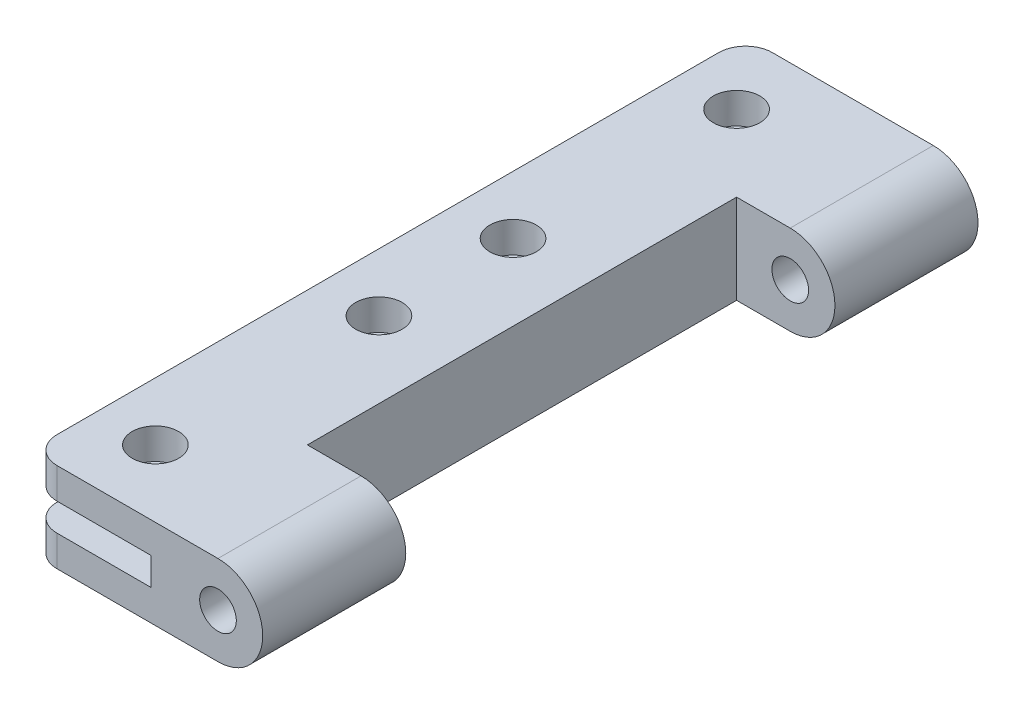
ISO-10303-21;
HEADER;
FILE_DESCRIPTION(('STEP AP214'),'2;1');
FILE_NAME('part.step','',(''),(''),'','','');
FILE_SCHEMA(('AUTOMOTIVE_DESIGN { 1 0 10303 214 1 1 1 1 }'));
ENDSEC;
DATA;
#1=APPLICATION_CONTEXT('core data for automotive mechanical design processes');
#2=APPLICATION_PROTOCOL_DEFINITION('international standard','automotive_design',2000,#1);
#3=PRODUCT_CONTEXT('',#1,'mechanical');
#4=PRODUCT('Part','Part','',(#3));
#5=PRODUCT_RELATED_PRODUCT_CATEGORY('part','',(#4));
#6=PRODUCT_DEFINITION_FORMATION('','',#4);
#7=PRODUCT_DEFINITION_CONTEXT('part definition',#1,'design');
#8=PRODUCT_DEFINITION('design','',#6,#7);
#9=PRODUCT_DEFINITION_SHAPE('','',#8);
#10=(LENGTH_UNIT() NAMED_UNIT(*) SI_UNIT(.MILLI.,.METRE.));
#11=(NAMED_UNIT(*) PLANE_ANGLE_UNIT() SI_UNIT($,.RADIAN.));
#12=(NAMED_UNIT(*) SI_UNIT($,.STERADIAN.) SOLID_ANGLE_UNIT());
#13=UNCERTAINTY_MEASURE_WITH_UNIT(LENGTH_MEASURE(1.E-05),#10,'distance_accuracy_value','');
#14=(GEOMETRIC_REPRESENTATION_CONTEXT(3) GLOBAL_UNCERTAINTY_ASSIGNED_CONTEXT((#13)) GLOBAL_UNIT_ASSIGNED_CONTEXT((#10,
#11,#12)) REPRESENTATION_CONTEXT('',''));
#15=CARTESIAN_POINT('',(0.,0.,0.));
#16=DIRECTION('',(0.,0.,1.));
#17=DIRECTION('',(1.,0.,0.));
#18=AXIS2_PLACEMENT_3D('',#15,#16,#17);
#19=CARTESIAN_POINT('',(21.,0.,80.));
#20=DIRECTION('',(0.,0.,-1.));
#21=DIRECTION('',(-1.,0.,0.));
#22=AXIS2_PLACEMENT_3D('',#19,#20,#21);
#23=CYLINDRICAL_SURFACE('',#22,5.);
#24=DIRECTION('',(0.,0.,-1.));
#25=VECTOR('',#24,1.);
#26=CARTESIAN_POINT('',(21.,5.,80.));
#27=LINE('',#26,#25);
#28=CARTESIAN_POINT('',(21.,5.,16.));
#29=VERTEX_POINT('',#28);
#30=CARTESIAN_POINT('',(21.,5.,0.));
#31=VERTEX_POINT('',#30);
#32=EDGE_CURVE('E269',#29,#31,#27,.T.);
#33=ORIENTED_EDGE('',*,*,#32,.F.);
#34=CARTESIAN_POINT('',(21.,0.,16.));
#35=DIRECTION('',(0.,0.,-1.));
#36=DIRECTION('',(-1.,0.,0.));
#37=AXIS2_PLACEMENT_3D('',#34,#35,#36);
#38=CIRCLE('',#37,5.);
#39=CARTESIAN_POINT('',(21.,-5.,16.));
#40=VERTEX_POINT('',#39);
#41=EDGE_CURVE('E181',#29,#40,#38,.T.);
#42=ORIENTED_EDGE('',*,*,#41,.T.);
#43=DIRECTION('',(0.,0.,-1.));
#44=VECTOR('',#43,1.);
#45=CARTESIAN_POINT('',(21.,-5.,80.));
#46=LINE('',#45,#44);
#47=CARTESIAN_POINT('',(21.,-5.,0.));
#48=VERTEX_POINT('',#47);
#49=EDGE_CURVE('E271',#40,#48,#46,.T.);
#50=ORIENTED_EDGE('',*,*,#49,.T.);
#51=CARTESIAN_POINT('',(21.,0.,0.));
#52=DIRECTION('',(0.,0.,1.));
#53=DIRECTION('',(-1.,0.,0.));
#54=AXIS2_PLACEMENT_3D('',#51,#52,#53);
#55=CIRCLE('',#54,5.);
#56=EDGE_CURVE('E264',#48,#31,#55,.T.);
#57=ORIENTED_EDGE('',*,*,#56,.T.);
#58=EDGE_LOOP('',(#33,#42,#50,#57));
#59=FACE_BOUND('',#58,.T.);
#60=ADVANCED_FACE('F34',(#59),#23,.T.);
#61=CARTESIAN_POINT('',(21.,0.,80.));
#62=DIRECTION('',(0.,0.,-1.));
#63=DIRECTION('',(-1.,0.,0.));
#64=AXIS2_PLACEMENT_3D('',#61,#62,#63);
#65=CYLINDRICAL_SURFACE('',#64,2.05);
#66=CARTESIAN_POINT('',(21.,0.,16.));
#67=DIRECTION('',(0.,0.,-1.));
#68=DIRECTION('',(-1.,0.,0.));
#69=AXIS2_PLACEMENT_3D('',#66,#67,#68);
#70=CIRCLE('',#69,2.05);
#71=CARTESIAN_POINT('',(18.95,0.,16.));
#72=VERTEX_POINT('',#71);
#73=EDGE_CURVE('E180',#72,#72,#70,.T.);
#74=CARTESIAN_POINT('',(21.,0.,0.));
#75=DIRECTION('',(0.,0.,1.));
#76=DIRECTION('',(1.,0.,0.));
#77=AXIS2_PLACEMENT_3D('',#74,#75,#76);
#78=CIRCLE('',#77,2.05);
#79=CARTESIAN_POINT('',(18.95,0.,0.));
#80=VERTEX_POINT('',#79);
#81=EDGE_CURVE('E247',#80,#80,#78,.T.);
#82=CARTESIAN_POINT('',(18.95,0.,16.));
#83=CARTESIAN_POINT('',(18.95,0.,15.8333333333333));
#84=CARTESIAN_POINT('',(18.95,0.,15.6666666666667));
#85=CARTESIAN_POINT('',(18.95,0.,15.3333333333333));
#86=CARTESIAN_POINT('',(18.95,0.,15.1666666666667));
#87=CARTESIAN_POINT('',(18.95,0.,14.8333333333333));
#88=CARTESIAN_POINT('',(18.95,0.,14.6666666666667));
#89=CARTESIAN_POINT('',(18.95,0.,14.3333333333333));
#90=CARTESIAN_POINT('',(18.95,0.,14.1666666666667));
#91=CARTESIAN_POINT('',(18.95,0.,13.8333333333333));
#92=CARTESIAN_POINT('',(18.95,0.,13.6666666666667));
#93=CARTESIAN_POINT('',(18.95,0.,13.3333333333333));
#94=CARTESIAN_POINT('',(18.95,0.,13.1666666666667));
#95=CARTESIAN_POINT('',(18.95,0.,12.8333333333333));
#96=CARTESIAN_POINT('',(18.95,0.,12.6666666666667));
#97=CARTESIAN_POINT('',(18.95,0.,12.3333333333333));
#98=CARTESIAN_POINT('',(18.95,0.,12.1666666666667));
#99=CARTESIAN_POINT('',(18.95,0.,11.8333333333333));
#100=CARTESIAN_POINT('',(18.95,0.,11.6666666666667));
#101=CARTESIAN_POINT('',(18.95,0.,11.3333333333333));
#102=CARTESIAN_POINT('',(18.95,0.,11.1666666666667));
#103=CARTESIAN_POINT('',(18.95,0.,10.8333333333333));
#104=CARTESIAN_POINT('',(18.95,0.,10.6666666666667));
#105=CARTESIAN_POINT('',(18.95,0.,10.3333333333333));
#106=CARTESIAN_POINT('',(18.95,0.,10.1666666666667));
#107=CARTESIAN_POINT('',(18.95,0.,9.83333333333334));
#108=CARTESIAN_POINT('',(18.95,0.,9.66666666666667));
#109=CARTESIAN_POINT('',(18.95,0.,9.33333333333334));
#110=CARTESIAN_POINT('',(18.95,0.,9.16666666666667));
#111=CARTESIAN_POINT('',(18.95,0.,8.83333333333334));
#112=CARTESIAN_POINT('',(18.95,0.,8.66666666666667));
#113=CARTESIAN_POINT('',(18.95,0.,8.33333333333334));
#114=CARTESIAN_POINT('',(18.95,0.,8.16666666666667));
#115=CARTESIAN_POINT('',(18.95,0.,7.83333333333334));
#116=CARTESIAN_POINT('',(18.95,0.,7.66666666666667));
#117=CARTESIAN_POINT('',(18.95,0.,7.33333333333334));
#118=CARTESIAN_POINT('',(18.95,0.,7.16666666666667));
#119=CARTESIAN_POINT('',(18.95,0.,6.83333333333334));
#120=CARTESIAN_POINT('',(18.95,0.,6.66666666666667));
#121=CARTESIAN_POINT('',(18.95,0.,6.33333333333334));
#122=CARTESIAN_POINT('',(18.95,0.,6.16666666666667));
#123=CARTESIAN_POINT('',(18.95,0.,5.83333333333334));
#124=CARTESIAN_POINT('',(18.95,0.,5.66666666666667));
#125=CARTESIAN_POINT('',(18.95,0.,5.33333333333334));
#126=CARTESIAN_POINT('',(18.95,0.,5.16666666666667));
#127=CARTESIAN_POINT('',(18.95,0.,4.83333333333334));
#128=CARTESIAN_POINT('',(18.95,0.,4.66666666666667));
#129=CARTESIAN_POINT('',(18.95,0.,4.33333333333334));
#130=CARTESIAN_POINT('',(18.95,0.,4.16666666666667));
#131=CARTESIAN_POINT('',(18.95,0.,3.83333333333334));
#132=CARTESIAN_POINT('',(18.95,0.,3.66666666666667));
#133=CARTESIAN_POINT('',(18.95,0.,3.33333333333334));
#134=CARTESIAN_POINT('',(18.95,0.,3.16666666666667));
#135=CARTESIAN_POINT('',(18.95,0.,2.83333333333334));
#136=CARTESIAN_POINT('',(18.95,0.,2.66666666666667));
#137=CARTESIAN_POINT('',(18.95,0.,2.33333333333334));
#138=CARTESIAN_POINT('',(18.95,0.,2.16666666666667));
#139=CARTESIAN_POINT('',(18.95,0.,1.83333333333334));
#140=CARTESIAN_POINT('',(18.95,0.,1.66666666666667));
#141=CARTESIAN_POINT('',(18.95,0.,1.33333333333333));
#142=CARTESIAN_POINT('',(18.95,0.,1.16666666666667));
#143=CARTESIAN_POINT('',(18.95,0.,0.833333333333334));
#144=CARTESIAN_POINT('',(18.95,0.,0.666666666666667));
#145=CARTESIAN_POINT('',(18.95,0.,0.333333333333334));
#146=CARTESIAN_POINT('',(18.95,0.,0.166666666666667));
#147=CARTESIAN_POINT('',(18.95,0.,0.));
#148=B_SPLINE_CURVE_WITH_KNOTS('',3,(#82,#83,#84,#85,#86,#87,#88,#89,#90,#91,#92,#93,#94,#95,
#96,#97,#98,#99,#100,#101,#102,#103,#104,#105,#106,#107,#108,#109,#110,#111,#112,#113,#114,#115,
#116,#117,#118,#119,#120,#121,#122,#123,#124,#125,#126,#127,#128,#129,#130,#131,#132,#133,#134,
#135,#136,#137,#138,#139,#140,#141,#142,#143,#144,#145,#146,#147),.UNSPECIFIED.,.F.,.F.,(4,2,2,
2,2,2,2,2,2,2,2,2,2,2,2,2,2,2,2,2,2,2,2,2,2,2,2,2,2,2,2,2,4),(0.,0.5,1.,1.5,2.,2.5,3.,3.5,4.,
4.5,5.,5.50000000000001,6.00000000000001,6.50000000000001,7.00000000000001,7.50000000000001,
8.00000000000001,8.50000000000001,9.00000000000001,9.50000000000001,10.,10.5,11.,11.5,12.,12.5,
13.,13.5,14.,14.5,15.,15.5,16.),.UNSPECIFIED.);
#149=EDGE_CURVE('BSEAM397',#72,#80,#148,.T.);
#150=ORIENTED_EDGE('',*,*,#73,.F.);
#151=ORIENTED_EDGE('',*,*,#81,.F.);
#152=ORIENTED_EDGE('',*,*,#149,.T.);
#153=ORIENTED_EDGE('',*,*,#149,.F.);
#154=EDGE_LOOP('',(#150,#152,#151,#153));
#155=FACE_BOUND('',#154,.T.);
#156=ADVANCED_FACE('F397',(#155),#65,.F.);
#157=CARTESIAN_POINT('',(0.,-5.,80.));
#158=DIRECTION('',(1.,0.,0.));
#159=DIRECTION('',(0.,1.,0.));
#160=AXIS2_PLACEMENT_3D('',#157,#158,#159);
#161=PLANE('',#160);
#162=DIRECTION('',(0.,0.,1.));
#163=VECTOR('',#162,1.);
#164=CARTESIAN_POINT('',(0.,1.55,80.));
#165=LINE('',#164,#163);
#166=CARTESIAN_POINT('',(0.,1.55,3.));
#167=VERTEX_POINT('',#166);
#168=CARTESIAN_POINT('',(0.,1.55,77.));
#169=VERTEX_POINT('',#168);
#170=EDGE_CURVE('E281',#167,#169,#165,.T.);
#171=ORIENTED_EDGE('',*,*,#170,.T.);
#172=DIRECTION('',(0.,-1.,0.));
#173=VECTOR('',#172,1.);
#174=CARTESIAN_POINT('',(0.,-5.,77.));
#175=LINE('',#174,#173);
#176=CARTESIAN_POINT('',(0.,5.,77.));
#177=VERTEX_POINT('',#176);
#178=EDGE_CURVE('E324',#169,#177,#175,.F.);
#179=ORIENTED_EDGE('',*,*,#178,.T.);
#180=DIRECTION('',(0.,0.,-1.));
#181=VECTOR('',#180,1.);
#182=CARTESIAN_POINT('',(0.,5.,80.));
#183=LINE('',#182,#181);
#184=CARTESIAN_POINT('',(0.,5.,3.00000000000003));
#185=VERTEX_POINT('',#184);
#186=EDGE_CURVE('E262',#177,#185,#183,.T.);
#187=ORIENTED_EDGE('',*,*,#186,.T.);
#188=DIRECTION('',(0.,-1.,0.));
#189=VECTOR('',#188,1.);
#190=CARTESIAN_POINT('',(0.,1.55,3.));
#191=LINE('',#190,#189);
#192=EDGE_CURVE('E321',#185,#167,#191,.T.);
#193=ORIENTED_EDGE('',*,*,#192,.T.);
#194=EDGE_LOOP('',(#171,#179,#187,#193));
#195=FACE_BOUND('',#194,.T.);
#196=ADVANCED_FACE('F343',(#195),#161,.F.);
#197=CARTESIAN_POINT('',(21.,0.,80.));
#198=DIRECTION('',(0.,0.,-1.));
#199=DIRECTION('',(-1.,0.,0.));
#200=AXIS2_PLACEMENT_3D('',#197,#198,#199);
#201=PLANE('',#200);
#202=DIRECTION('',(1.,0.,0.));
#203=VECTOR('',#202,1.);
#204=CARTESIAN_POINT('',(13.5,-1.55,80.));
#205=LINE('',#204,#203);
#206=CARTESIAN_POINT('',(3.,-1.55,80.));
#207=VERTEX_POINT('',#206);
#208=CARTESIAN_POINT('',(13.5,-1.55,80.));
#209=VERTEX_POINT('',#208);
#210=EDGE_CURVE('E229',#207,#209,#205,.T.);
#211=ORIENTED_EDGE('',*,*,#210,.F.);
#212=DIRECTION('',(0.,-1.,0.));
#213=VECTOR('',#212,1.);
#214=CARTESIAN_POINT('',(3.,0.,80.));
#215=LINE('',#214,#213);
#216=CARTESIAN_POINT('',(3.00000000000001,-5.,80.));
#217=VERTEX_POINT('',#216);
#218=EDGE_CURVE('E301',#207,#217,#215,.T.);
#219=ORIENTED_EDGE('',*,*,#218,.T.);
#220=DIRECTION('',(1.,0.,0.));
#221=VECTOR('',#220,1.);
#222=CARTESIAN_POINT('',(21.,-5.,80.));
#223=LINE('',#222,#221);
#224=CARTESIAN_POINT('',(21.,-5.,80.));
#225=VERTEX_POINT('',#224);
#226=EDGE_CURVE('E254',#217,#225,#223,.T.);
#227=ORIENTED_EDGE('',*,*,#226,.T.);
#228=CARTESIAN_POINT('',(21.,0.,80.));
#229=DIRECTION('',(0.,0.,1.));
#230=DIRECTION('',(-1.,0.,0.));
#231=AXIS2_PLACEMENT_3D('',#228,#229,#230);
#232=CIRCLE('',#231,5.);
#233=CARTESIAN_POINT('',(21.,5.,80.));
#234=VERTEX_POINT('',#233);
#235=EDGE_CURVE('E256',#225,#234,#232,.T.);
#236=ORIENTED_EDGE('',*,*,#235,.T.);
#237=DIRECTION('',(-1.,0.,0.));
#238=VECTOR('',#237,1.);
#239=CARTESIAN_POINT('',(0.,5.,80.));
#240=LINE('',#239,#238);
#241=CARTESIAN_POINT('',(3.,5.,80.));
#242=VERTEX_POINT('',#241);
#243=EDGE_CURVE('E259',#234,#242,#240,.T.);
#244=ORIENTED_EDGE('',*,*,#243,.T.);
#245=DIRECTION('',(0.,-1.,0.));
#246=VECTOR('',#245,1.);
#247=CARTESIAN_POINT('',(3.,0.,80.));
#248=LINE('',#247,#246);
#249=CARTESIAN_POINT('',(3.,1.55,80.));
#250=VERTEX_POINT('',#249);
#251=EDGE_CURVE('E286',#242,#250,#248,.T.);
#252=ORIENTED_EDGE('',*,*,#251,.T.);
#253=DIRECTION('',(-1.,0.,0.));
#254=VECTOR('',#253,1.);
#255=CARTESIAN_POINT('',(0.,1.55,80.));
#256=LINE('',#255,#254);
#257=CARTESIAN_POINT('',(13.5,1.55,80.));
#258=VERTEX_POINT('',#257);
#259=EDGE_CURVE('E234',#258,#250,#256,.T.);
#260=ORIENTED_EDGE('',*,*,#259,.F.);
#261=DIRECTION('',(0.,1.,0.));
#262=VECTOR('',#261,1.);
#263=CARTESIAN_POINT('',(13.5,1.55,80.));
#264=LINE('',#263,#262);
#265=EDGE_CURVE('E231',#209,#258,#264,.T.);
#266=ORIENTED_EDGE('',*,*,#265,.F.);
#267=EDGE_LOOP('',(#211,#219,#227,#236,#244,#252,#260,#266));
#268=FACE_BOUND('',#267,.T.);
#269=CARTESIAN_POINT('',(21.,0.,80.));
#270=DIRECTION('',(0.,0.,1.));
#271=DIRECTION('',(1.,0.,0.));
#272=AXIS2_PLACEMENT_3D('',#269,#270,#271);
#273=CIRCLE('',#272,2.05);
#274=CARTESIAN_POINT('',(18.95,0.,80.));
#275=VERTEX_POINT('',#274);
#276=EDGE_CURVE('E248',#275,#275,#273,.T.);
#277=ORIENTED_EDGE('',*,*,#276,.F.);
#278=EDGE_LOOP('',(#277));
#279=FACE_BOUND('',#278,.T.);
#280=ADVANCED_FACE('F334',(#268,#279),#201,.F.);
#281=CARTESIAN_POINT('',(21.,0.,0.));
#282=DIRECTION('',(0.,0.,-1.));
#283=DIRECTION('',(-1.,0.,0.));
#284=AXIS2_PLACEMENT_3D('',#281,#282,#283);
#285=PLANE('',#284);
#286=DIRECTION('',(1.,0.,0.));
#287=VECTOR('',#286,1.);
#288=CARTESIAN_POINT('',(21.,-5.,0.));
#289=LINE('',#288,#287);
#290=CARTESIAN_POINT('',(3.00000000000001,-5.,0.));
#291=VERTEX_POINT('',#290);
#292=EDGE_CURVE('E251',#291,#48,#289,.T.);
#293=ORIENTED_EDGE('',*,*,#292,.F.);
#294=DIRECTION('',(0.,-1.,0.));
#295=VECTOR('',#294,1.);
#296=CARTESIAN_POINT('',(3.,-1.55,0.));
#297=LINE('',#296,#295);
#298=CARTESIAN_POINT('',(3.,-1.55,0.));
#299=VERTEX_POINT('',#298);
#300=EDGE_CURVE('E11',#291,#299,#297,.F.);
#301=ORIENTED_EDGE('',*,*,#300,.T.);
#302=DIRECTION('',(-1.,0.,0.));
#303=VECTOR('',#302,1.);
#304=CARTESIAN_POINT('',(21.,-1.55,0.));
#305=LINE('',#304,#303);
#306=CARTESIAN_POINT('',(13.5,-1.55,0.));
#307=VERTEX_POINT('',#306);
#308=EDGE_CURVE('E240',#307,#299,#305,.T.);
#309=ORIENTED_EDGE('',*,*,#308,.F.);
#310=DIRECTION('',(0.,-1.,0.));
#311=VECTOR('',#310,1.);
#312=CARTESIAN_POINT('',(13.5,0.,0.));
#313=LINE('',#312,#311);
#314=CARTESIAN_POINT('',(13.5,1.55,0.));
#315=VERTEX_POINT('',#314);
#316=EDGE_CURVE('E284',#315,#307,#313,.T.);
#317=ORIENTED_EDGE('',*,*,#316,.F.);
#318=DIRECTION('',(1.,0.,0.));
#319=VECTOR('',#318,1.);
#320=CARTESIAN_POINT('',(21.,1.55,0.));
#321=LINE('',#320,#319);
#322=CARTESIAN_POINT('',(3.,1.55,0.));
#323=VERTEX_POINT('',#322);
#324=EDGE_CURVE('E245',#323,#315,#321,.T.);
#325=ORIENTED_EDGE('',*,*,#324,.F.);
#326=DIRECTION('',(0.,-1.,0.));
#327=VECTOR('',#326,1.);
#328=CARTESIAN_POINT('',(3.,5.,0.));
#329=LINE('',#328,#327);
#330=CARTESIAN_POINT('',(3.,5.,0.));
#331=VERTEX_POINT('',#330);
#332=EDGE_CURVE('E42',#323,#331,#329,.F.);
#333=ORIENTED_EDGE('',*,*,#332,.T.);
#334=DIRECTION('',(-1.,0.,0.));
#335=VECTOR('',#334,1.);
#336=CARTESIAN_POINT('',(0.,5.,0.));
#337=LINE('',#336,#335);
#338=EDGE_CURVE('E257',#31,#331,#337,.T.);
#339=ORIENTED_EDGE('',*,*,#338,.F.);
#340=ORIENTED_EDGE('',*,*,#56,.F.);
#341=EDGE_LOOP('',(#293,#301,#309,#317,#325,#333,#339,#340));
#342=FACE_BOUND('',#341,.T.);
#343=ORIENTED_EDGE('',*,*,#81,.T.);
#344=EDGE_LOOP('',(#343));
#345=FACE_BOUND('',#344,.T.);
#346=ADVANCED_FACE('F349',(#342,#345),#285,.T.);
#347=DIRECTION('',(0.,0.,-1.));
#348=VECTOR('',#347,1.);
#349=CARTESIAN_POINT('',(0.,-5.,80.));
#350=LINE('',#349,#348);
#351=CARTESIAN_POINT('',(0.,-5.,77.));
#352=VERTEX_POINT('',#351);
#353=CARTESIAN_POINT('',(0.,-5.,3.00000000000003));
#354=VERTEX_POINT('',#353);
#355=EDGE_CURVE('E275',#352,#354,#350,.T.);
#356=ORIENTED_EDGE('',*,*,#355,.F.);
#357=DIRECTION('',(0.,-1.,0.));
#358=VECTOR('',#357,1.);
#359=CARTESIAN_POINT('',(0.,-5.,77.));
#360=LINE('',#359,#358);
#361=CARTESIAN_POINT('',(0.,-1.55,77.));
#362=VERTEX_POINT('',#361);
#363=EDGE_CURVE('E311',#352,#362,#360,.F.);
#364=ORIENTED_EDGE('',*,*,#363,.T.);
#365=DIRECTION('',(0.,0.,-1.));
#366=VECTOR('',#365,1.);
#367=CARTESIAN_POINT('',(0.,-1.55,80.));
#368=LINE('',#367,#366);
#369=CARTESIAN_POINT('',(0.,-1.55,3.));
#370=VERTEX_POINT('',#369);
#371=EDGE_CURVE('E278',#362,#370,#368,.T.);
#372=ORIENTED_EDGE('',*,*,#371,.T.);
#373=DIRECTION('',(0.,-1.,0.));
#374=VECTOR('',#373,1.);
#375=CARTESIAN_POINT('',(0.,-5.,3.));
#376=LINE('',#375,#374);
#377=EDGE_CURVE('E308',#370,#354,#376,.T.);
#378=ORIENTED_EDGE('',*,*,#377,.T.);
#379=EDGE_LOOP('',(#356,#364,#372,#378));
#380=FACE_BOUND('',#379,.T.);
#381=ADVANCED_FACE('F372',(#380),#161,.F.);
#382=CARTESIAN_POINT('',(21.,-5.,80.));
#383=DIRECTION('',(0.,1.,0.));
#384=DIRECTION('',(-1.,0.,0.));
#385=AXIS2_PLACEMENT_3D('',#382,#383,#384);
#386=PLANE('',#385);
#387=ORIENTED_EDGE('',*,*,#226,.F.);
#388=CARTESIAN_POINT('',(3.,-5.,77.));
#389=DIRECTION('',(0.,1.,0.));
#390=DIRECTION('',(-1.,0.,0.));
#391=AXIS2_PLACEMENT_3D('',#388,#389,#390);
#392=CIRCLE('',#391,3.);
#393=EDGE_CURVE('E306',#217,#352,#392,.F.);
#394=ORIENTED_EDGE('',*,*,#393,.T.);
#395=ORIENTED_EDGE('',*,*,#355,.T.);
#396=CARTESIAN_POINT('',(3.,-5.,3.));
#397=DIRECTION('',(0.,1.,0.));
#398=DIRECTION('',(-1.,0.,0.));
#399=AXIS2_PLACEMENT_3D('',#396,#397,#398);
#400=CIRCLE('',#399,3.);
#401=EDGE_CURVE('E304',#354,#291,#400,.F.);
#402=ORIENTED_EDGE('',*,*,#401,.T.);
#403=ORIENTED_EDGE('',*,*,#292,.T.);
#404=ORIENTED_EDGE('',*,*,#49,.F.);
#405=DIRECTION('',(-1.,0.,0.));
#406=VECTOR('',#405,1.);
#407=CARTESIAN_POINT('',(21.,-5.,16.));
#408=LINE('',#407,#406);
#409=CARTESIAN_POINT('',(14.9999999999998,-5.,16.));
#410=VERTEX_POINT('',#409);
#411=EDGE_CURVE('E184',#40,#410,#408,.T.);
#412=ORIENTED_EDGE('',*,*,#411,.T.);
#413=DIRECTION('',(0.,0.,1.));
#414=VECTOR('',#413,1.);
#415=CARTESIAN_POINT('',(14.9999999999998,-5.,80.));
#416=LINE('',#415,#414);
#417=CARTESIAN_POINT('',(14.9999999999998,-5.,64.));
#418=VERTEX_POINT('',#417);
#419=EDGE_CURVE('E187',#410,#418,#416,.T.);
#420=ORIENTED_EDGE('',*,*,#419,.T.);
#421=DIRECTION('',(1.,0.,0.));
#422=VECTOR('',#421,1.);
#423=CARTESIAN_POINT('',(21.,-5.,64.));
#424=LINE('',#423,#422);
#425=CARTESIAN_POINT('',(21.,-5.,64.));
#426=VERTEX_POINT('',#425);
#427=EDGE_CURVE('E154',#418,#426,#424,.T.);
#428=ORIENTED_EDGE('',*,*,#427,.T.);
#429=EDGE_CURVE('E272',#225,#426,#46,.T.);
#430=ORIENTED_EDGE('',*,*,#429,.F.);
#431=EDGE_LOOP('',(#387,#394,#395,#402,#403,#404,#412,#420,#428,#430));
#432=FACE_BOUND('',#431,.T.);
#433=CARTESIAN_POINT('',(6.5,-5.,7.50000000000001));
#434=DIRECTION('',(0.,1.,0.));
#435=DIRECTION('',(-1.,0.,0.));
#436=AXIS2_PLACEMENT_3D('',#433,#434,#435);
#437=CIRCLE('',#436,2.6);
#438=CARTESIAN_POINT('',(3.9,-5.,7.50000000000001));
#439=VERTEX_POINT('',#438);
#440=EDGE_CURVE('E226',#439,#439,#437,.T.);
#441=ORIENTED_EDGE('',*,*,#440,.T.);
#442=EDGE_LOOP('',(#441));
#443=FACE_BOUND('',#442,.T.);
#444=CARTESIAN_POINT('',(6.5,-5.,47.5));
#445=DIRECTION('',(0.,1.,0.));
#446=DIRECTION('',(-1.,0.,0.));
#447=AXIS2_PLACEMENT_3D('',#444,#445,#446);
#448=CIRCLE('',#447,2.59999999999999);
#449=CARTESIAN_POINT('',(3.90000000000001,-5.,47.5));
#450=VERTEX_POINT('',#449);
#451=EDGE_CURVE('E219',#450,#450,#448,.T.);
#452=ORIENTED_EDGE('',*,*,#451,.T.);
#453=EDGE_LOOP('',(#452));
#454=FACE_BOUND('',#453,.T.);
#455=CARTESIAN_POINT('',(6.5,-5.,72.5));
#456=DIRECTION('',(0.,1.,0.));
#457=DIRECTION('',(-1.,0.,0.));
#458=AXIS2_PLACEMENT_3D('',#455,#456,#457);
#459=CIRCLE('',#458,2.6);
#460=CARTESIAN_POINT('',(3.9,-5.,72.5));
#461=VERTEX_POINT('',#460);
#462=EDGE_CURVE('E212',#461,#461,#459,.T.);
#463=ORIENTED_EDGE('',*,*,#462,.T.);
#464=EDGE_LOOP('',(#463));
#465=FACE_BOUND('',#464,.T.);
#466=CARTESIAN_POINT('',(6.5,-5.,32.5));
#467=DIRECTION('',(0.,1.,0.));
#468=DIRECTION('',(-1.,0.,0.));
#469=AXIS2_PLACEMENT_3D('',#466,#467,#468);
#470=CIRCLE('',#469,2.59999999999999);
#471=CARTESIAN_POINT('',(3.90000000000001,-5.,32.5));
#472=VERTEX_POINT('',#471);
#473=EDGE_CURVE('E205',#472,#472,#470,.T.);
#474=ORIENTED_EDGE('',*,*,#473,.T.);
#475=EDGE_LOOP('',(#474));
#476=FACE_BOUND('',#475,.T.);
#477=ADVANCED_FACE('F368',(#432,#443,#454,#465,#476),#386,.F.);
#478=ORIENTED_EDGE('',*,*,#429,.T.);
#479=CARTESIAN_POINT('',(21.,0.,64.));
#480=DIRECTION('',(0.,0.,1.));
#481=DIRECTION('',(1.,0.,0.));
#482=AXIS2_PLACEMENT_3D('',#479,#480,#481);
#483=CIRCLE('',#482,5.);
#484=CARTESIAN_POINT('',(21.,5.,64.));
#485=VERTEX_POINT('',#484);
#486=EDGE_CURVE('E177',#426,#485,#483,.T.);
#487=ORIENTED_EDGE('',*,*,#486,.T.);
#488=EDGE_CURVE('E172',#234,#485,#27,.T.);
#489=ORIENTED_EDGE('',*,*,#488,.F.);
#490=ORIENTED_EDGE('',*,*,#235,.F.);
#491=EDGE_LOOP('',(#478,#487,#489,#490));
#492=FACE_BOUND('',#491,.T.);
#493=ADVANCED_FACE('F399',(#492),#23,.T.);
#494=CARTESIAN_POINT('',(0.,5.,80.));
#495=DIRECTION('',(0.,-1.,0.));
#496=DIRECTION('',(0.,0.,-1.));
#497=AXIS2_PLACEMENT_3D('',#494,#495,#496);
#498=PLANE('',#497);
#499=CARTESIAN_POINT('',(6.5,5.,7.50000000000001));
#500=DIRECTION('',(0.,1.,0.));
#501=DIRECTION('',(0.,0.,1.));
#502=AXIS2_PLACEMENT_3D('',#499,#500,#501);
#503=CIRCLE('',#502,2.6);
#504=CARTESIAN_POINT('',(6.5,5.,10.1));
#505=VERTEX_POINT('',#504);
#506=EDGE_CURVE('E189',#505,#505,#503,.T.);
#507=ORIENTED_EDGE('',*,*,#506,.F.);
#508=EDGE_LOOP('',(#507));
#509=FACE_BOUND('',#508,.T.);
#510=CARTESIAN_POINT('',(6.5,5.,47.5));
#511=DIRECTION('',(0.,1.,0.));
#512=DIRECTION('',(0.,0.,1.));
#513=AXIS2_PLACEMENT_3D('',#510,#511,#512);
#514=CIRCLE('',#513,2.59999999999999);
#515=CARTESIAN_POINT('',(6.5,5.,50.1));
#516=VERTEX_POINT('',#515);
#517=EDGE_CURVE('E194',#516,#516,#514,.T.);
#518=ORIENTED_EDGE('',*,*,#517,.F.);
#519=EDGE_LOOP('',(#518));
#520=FACE_BOUND('',#519,.T.);
#521=CARTESIAN_POINT('',(6.5,5.,72.5));
#522=DIRECTION('',(0.,1.,0.));
#523=DIRECTION('',(0.,0.,-1.));
#524=AXIS2_PLACEMENT_3D('',#521,#522,#523);
#525=CIRCLE('',#524,2.6);
#526=CARTESIAN_POINT('',(6.5,5.,69.9));
#527=VERTEX_POINT('',#526);
#528=EDGE_CURVE('E190',#527,#527,#525,.T.);
#529=ORIENTED_EDGE('',*,*,#528,.F.);
#530=EDGE_LOOP('',(#529));
#531=FACE_BOUND('',#530,.T.);
#532=CARTESIAN_POINT('',(6.5,5.,32.5));
#533=DIRECTION('',(0.,1.,0.));
#534=DIRECTION('',(0.,0.,-1.));
#535=AXIS2_PLACEMENT_3D('',#532,#533,#534);
#536=CIRCLE('',#535,2.59999999999999);
#537=CARTESIAN_POINT('',(6.5,5.,29.9));
#538=VERTEX_POINT('',#537);
#539=EDGE_CURVE('E193',#538,#538,#536,.T.);
#540=ORIENTED_EDGE('',*,*,#539,.F.);
#541=EDGE_LOOP('',(#540));
#542=FACE_BOUND('',#541,.T.);
#543=ORIENTED_EDGE('',*,*,#186,.F.);
#544=CARTESIAN_POINT('',(3.,5.,77.));
#545=DIRECTION('',(0.,-1.,0.));
#546=DIRECTION('',(0.,0.,-1.));
#547=AXIS2_PLACEMENT_3D('',#544,#545,#546);
#548=CIRCLE('',#547,3.);
#549=EDGE_CURVE('E327',#177,#242,#548,.F.);
#550=ORIENTED_EDGE('',*,*,#549,.T.);
#551=ORIENTED_EDGE('',*,*,#243,.F.);
#552=ORIENTED_EDGE('',*,*,#488,.T.);
#553=DIRECTION('',(1.,0.,0.));
#554=VECTOR('',#553,1.);
#555=CARTESIAN_POINT('',(14.9999999999998,5.,64.));
#556=LINE('',#555,#554);
#557=CARTESIAN_POINT('',(14.9999999999998,5.,64.));
#558=VERTEX_POINT('',#557);
#559=EDGE_CURVE('E151',#558,#485,#556,.T.);
#560=ORIENTED_EDGE('',*,*,#559,.F.);
#561=DIRECTION('',(0.,0.,1.));
#562=VECTOR('',#561,1.);
#563=CARTESIAN_POINT('',(14.9999999999998,5.,16.));
#564=LINE('',#563,#562);
#565=CARTESIAN_POINT('',(14.9999999999998,5.,16.));
#566=VERTEX_POINT('',#565);
#567=EDGE_CURVE('E162',#566,#558,#564,.T.);
#568=ORIENTED_EDGE('',*,*,#567,.F.);
#569=DIRECTION('',(-1.,0.,0.));
#570=VECTOR('',#569,1.);
#571=CARTESIAN_POINT('',(47.1159337159435,5.,16.));
#572=LINE('',#571,#570);
#573=EDGE_CURVE('E166',#29,#566,#572,.T.);
#574=ORIENTED_EDGE('',*,*,#573,.F.);
#575=ORIENTED_EDGE('',*,*,#32,.T.);
#576=ORIENTED_EDGE('',*,*,#338,.T.);
#577=CARTESIAN_POINT('',(3.,5.,3.));
#578=DIRECTION('',(0.,-1.,0.));
#579=DIRECTION('',(0.,0.,-1.));
#580=AXIS2_PLACEMENT_3D('',#577,#578,#579);
#581=CIRCLE('',#580,3.);
#582=EDGE_CURVE('E55',#331,#185,#581,.F.);
#583=ORIENTED_EDGE('',*,*,#582,.T.);
#584=EDGE_LOOP('',(#543,#550,#551,#552,#560,#568,#574,#575,#576,#583));
#585=FACE_BOUND('',#584,.T.);
#586=ADVANCED_FACE('F169',(#509,#520,#531,#542,#585),#498,.F.);
#587=CARTESIAN_POINT('',(21.,0.,64.));
#588=DIRECTION('',(0.,0.,1.));
#589=DIRECTION('',(1.,0.,0.));
#590=AXIS2_PLACEMENT_3D('',#587,#588,#589);
#591=CIRCLE('',#590,2.05);
#592=CARTESIAN_POINT('',(18.95,0.,64.));
#593=VERTEX_POINT('',#592);
#594=EDGE_CURVE('E157',#593,#593,#591,.T.);
#595=CARTESIAN_POINT('',(18.95,0.,64.));
#596=CARTESIAN_POINT('',(18.95,0.,64.1666666666667));
#597=CARTESIAN_POINT('',(18.95,0.,64.3333333333334));
#598=CARTESIAN_POINT('',(18.95,0.,64.6666666666667));
#599=CARTESIAN_POINT('',(18.95,0.,64.8333333333334));
#600=CARTESIAN_POINT('',(18.95,0.,65.1666666666667));
#601=CARTESIAN_POINT('',(18.95,0.,65.3333333333334));
#602=CARTESIAN_POINT('',(18.95,0.,65.6666666666667));
#603=CARTESIAN_POINT('',(18.95,0.,65.8333333333334));
#604=CARTESIAN_POINT('',(18.95,0.,66.1666666666667));
#605=CARTESIAN_POINT('',(18.95,0.,66.3333333333334));
#606=CARTESIAN_POINT('',(18.95,0.,66.6666666666667));
#607=CARTESIAN_POINT('',(18.95,0.,66.8333333333334));
#608=CARTESIAN_POINT('',(18.95,0.,67.1666666666667));
#609=CARTESIAN_POINT('',(18.95,0.,67.3333333333334));
#610=CARTESIAN_POINT('',(18.95,0.,67.6666666666667));
#611=CARTESIAN_POINT('',(18.95,0.,67.8333333333334));
#612=CARTESIAN_POINT('',(18.95,0.,68.1666666666667));
#613=CARTESIAN_POINT('',(18.95,0.,68.3333333333334));
#614=CARTESIAN_POINT('',(18.95,0.,68.6666666666667));
#615=CARTESIAN_POINT('',(18.95,0.,68.8333333333334));
#616=CARTESIAN_POINT('',(18.95,0.,69.1666666666667));
#617=CARTESIAN_POINT('',(18.95,0.,69.3333333333334));
#618=CARTESIAN_POINT('',(18.95,0.,69.6666666666667));
#619=CARTESIAN_POINT('',(18.95,0.,69.8333333333334));
#620=CARTESIAN_POINT('',(18.95,0.,70.1666666666667));
#621=CARTESIAN_POINT('',(18.95,0.,70.3333333333334));
#622=CARTESIAN_POINT('',(18.95,0.,70.6666666666667));
#623=CARTESIAN_POINT('',(18.95,0.,70.8333333333334));
#624=CARTESIAN_POINT('',(18.95,0.,71.1666666666667));
#625=CARTESIAN_POINT('',(18.95,0.,71.3333333333334));
#626=CARTESIAN_POINT('',(18.95,0.,71.6666666666667));
#627=CARTESIAN_POINT('',(18.95,0.,71.8333333333334));
#628=CARTESIAN_POINT('',(18.95,0.,72.1666666666667));
#629=CARTESIAN_POINT('',(18.95,0.,72.3333333333334));
#630=CARTESIAN_POINT('',(18.95,0.,72.6666666666667));
#631=CARTESIAN_POINT('',(18.95,0.,72.8333333333334));
#632=CARTESIAN_POINT('',(18.95,0.,73.1666666666667));
#633=CARTESIAN_POINT('',(18.95,0.,73.3333333333334));
#634=CARTESIAN_POINT('',(18.95,0.,73.6666666666667));
#635=CARTESIAN_POINT('',(18.95,0.,73.8333333333334));
#636=CARTESIAN_POINT('',(18.95,0.,74.1666666666667));
#637=CARTESIAN_POINT('',(18.95,0.,74.3333333333334));
#638=CARTESIAN_POINT('',(18.95,0.,74.6666666666667));
#639=CARTESIAN_POINT('',(18.95,0.,74.8333333333334));
#640=CARTESIAN_POINT('',(18.95,0.,75.1666666666667));
#641=CARTESIAN_POINT('',(18.95,0.,75.3333333333334));
#642=CARTESIAN_POINT('',(18.95,0.,75.6666666666667));
#643=CARTESIAN_POINT('',(18.95,0.,75.8333333333334));
#644=CARTESIAN_POINT('',(18.95,0.,76.1666666666667));
#645=CARTESIAN_POINT('',(18.95,0.,76.3333333333334));
#646=CARTESIAN_POINT('',(18.95,0.,76.6666666666667));
#647=CARTESIAN_POINT('',(18.95,0.,76.8333333333334));
#648=CARTESIAN_POINT('',(18.95,0.,77.1666666666667));
#649=CARTESIAN_POINT('',(18.95,0.,77.3333333333334));
#650=CARTESIAN_POINT('',(18.95,0.,77.6666666666667));
#651=CARTESIAN_POINT('',(18.95,0.,77.8333333333334));
#652=CARTESIAN_POINT('',(18.95,0.,78.1666666666667));
#653=CARTESIAN_POINT('',(18.95,0.,78.3333333333334));
#654=CARTESIAN_POINT('',(18.95,0.,78.6666666666667));
#655=CARTESIAN_POINT('',(18.95,0.,78.8333333333334));
#656=CARTESIAN_POINT('',(18.95,0.,79.1666666666667));
#657=CARTESIAN_POINT('',(18.95,0.,79.3333333333334));
#658=CARTESIAN_POINT('',(18.95,0.,79.6666666666667));
#659=CARTESIAN_POINT('',(18.95,0.,79.8333333333334));
#660=CARTESIAN_POINT('',(18.95,0.,80.));
#661=B_SPLINE_CURVE_WITH_KNOTS('',3,(#595,#596,#597,#598,#599,#600,#601,#602,#603,#604,#605,
#606,#607,#608,#609,#610,#611,#612,#613,#614,#615,#616,#617,#618,#619,#620,#621,#622,#623,#624,
#625,#626,#627,#628,#629,#630,#631,#632,#633,#634,#635,#636,#637,#638,#639,#640,#641,#642,#643,
#644,#645,#646,#647,#648,#649,#650,#651,#652,#653,#654,#655,#656,#657,#658,#659,#660),
.UNSPECIFIED.,.F.,.F.,(4,2,2,2,2,2,2,2,2,2,2,2,2,2,2,2,2,2,2,2,2,2,2,2,2,2,2,2,2,2,2,2,4),(0.,
0.5,1.,1.5,2.,2.5,3.,3.5,4.,4.5,5.,5.50000000000001,6.00000000000001,6.50000000000001,
7.00000000000001,7.50000000000001,8.00000000000001,8.50000000000001,9.00000000000001,
9.50000000000001,10.,10.5,11.,11.5,12.,12.5,13.,13.5,14.,14.5,15.,15.5,16.),.UNSPECIFIED.);
#662=EDGE_CURVE('BSEAM405',#593,#275,#661,.T.);
#663=ORIENTED_EDGE('',*,*,#594,.F.);
#664=ORIENTED_EDGE('',*,*,#276,.T.);
#665=ORIENTED_EDGE('',*,*,#662,.T.);
#666=ORIENTED_EDGE('',*,*,#662,.F.);
#667=EDGE_LOOP('',(#663,#665,#664,#666));
#668=FACE_BOUND('',#667,.T.);
#669=ADVANCED_FACE('F405',(#668),#65,.F.);
#670=CARTESIAN_POINT('',(0.,1.55,-15.));
#671=DIRECTION('',(0.,1.,0.));
#672=DIRECTION('',(-1.,0.,0.));
#673=AXIS2_PLACEMENT_3D('',#670,#671,#672);
#674=PLANE('',#673);
#675=CARTESIAN_POINT('',(6.5,1.55,7.50000000000001));
#676=DIRECTION('',(0.,1.,0.));
#677=DIRECTION('',(-1.,0.,0.));
#678=AXIS2_PLACEMENT_3D('',#675,#676,#677);
#679=CIRCLE('',#678,2.6);
#680=CARTESIAN_POINT('',(3.9,1.55,7.50000000000001));
#681=VERTEX_POINT('',#680);
#682=EDGE_CURVE('E223',#681,#681,#679,.T.);
#683=ORIENTED_EDGE('',*,*,#682,.T.);
#684=EDGE_LOOP('',(#683));
#685=FACE_BOUND('',#684,.T.);
#686=CARTESIAN_POINT('',(6.5,1.55,47.5));
#687=DIRECTION('',(0.,1.,0.));
#688=DIRECTION('',(-1.,0.,0.));
#689=AXIS2_PLACEMENT_3D('',#686,#687,#688);
#690=CIRCLE('',#689,2.59999999999999);
#691=CARTESIAN_POINT('',(3.90000000000001,1.55,47.5));
#692=VERTEX_POINT('',#691);
#693=EDGE_CURVE('E216',#692,#692,#690,.T.);
#694=ORIENTED_EDGE('',*,*,#693,.T.);
#695=EDGE_LOOP('',(#694));
#696=FACE_BOUND('',#695,.T.);
#697=CARTESIAN_POINT('',(6.5,1.55,72.5));
#698=DIRECTION('',(0.,1.,0.));
#699=DIRECTION('',(-1.,0.,0.));
#700=AXIS2_PLACEMENT_3D('',#697,#698,#699);
#701=CIRCLE('',#700,2.6);
#702=CARTESIAN_POINT('',(3.9,1.55,72.5));
#703=VERTEX_POINT('',#702);
#704=EDGE_CURVE('E209',#703,#703,#701,.T.);
#705=ORIENTED_EDGE('',*,*,#704,.T.);
#706=EDGE_LOOP('',(#705));
#707=FACE_BOUND('',#706,.T.);
#708=CARTESIAN_POINT('',(6.5,1.55,32.5));
#709=DIRECTION('',(0.,1.,0.));
#710=DIRECTION('',(-1.,0.,0.));
#711=AXIS2_PLACEMENT_3D('',#708,#709,#710);
#712=CIRCLE('',#711,2.59999999999999);
#713=CARTESIAN_POINT('',(3.90000000000001,1.55,32.5));
#714=VERTEX_POINT('',#713);
#715=EDGE_CURVE('E202',#714,#714,#712,.T.);
#716=ORIENTED_EDGE('',*,*,#715,.T.);
#717=EDGE_LOOP('',(#716));
#718=FACE_BOUND('',#717,.T.);
#719=ORIENTED_EDGE('',*,*,#259,.T.);
#720=CARTESIAN_POINT('',(3.,1.55,77.));
#721=DIRECTION('',(0.,1.,0.));
#722=DIRECTION('',(-1.,0.,0.));
#723=AXIS2_PLACEMENT_3D('',#720,#721,#722);
#724=CIRCLE('',#723,3.);
#725=EDGE_CURVE('E319',#250,#169,#724,.F.);
#726=ORIENTED_EDGE('',*,*,#725,.T.);
#727=ORIENTED_EDGE('',*,*,#170,.F.);
#728=CARTESIAN_POINT('',(3.,1.55,3.));
#729=DIRECTION('',(0.,1.,0.));
#730=DIRECTION('',(-1.,0.,0.));
#731=AXIS2_PLACEMENT_3D('',#728,#729,#730);
#732=CIRCLE('',#731,3.);
#733=EDGE_CURVE('E317',#167,#323,#732,.F.);
#734=ORIENTED_EDGE('',*,*,#733,.T.);
#735=ORIENTED_EDGE('',*,*,#324,.T.);
#736=DIRECTION('',(0.,0.,1.));
#737=VECTOR('',#736,1.);
#738=CARTESIAN_POINT('',(13.5,1.55,-15.));
#739=LINE('',#738,#737);
#740=EDGE_CURVE('E238',#315,#258,#739,.T.);
#741=ORIENTED_EDGE('',*,*,#740,.T.);
#742=EDGE_LOOP('',(#719,#726,#727,#734,#735,#741));
#743=FACE_BOUND('',#742,.T.);
#744=ADVANCED_FACE('F341',(#685,#696,#707,#718,#743),#674,.F.);
#745=CARTESIAN_POINT('',(13.5,1.55,-15.));
#746=DIRECTION('',(1.,0.,0.));
#747=DIRECTION('',(0.,0.,-1.));
#748=AXIS2_PLACEMENT_3D('',#745,#746,#747);
#749=PLANE('',#748);
#750=ORIENTED_EDGE('',*,*,#316,.T.);
#751=DIRECTION('',(0.,0.,1.));
#752=VECTOR('',#751,1.);
#753=CARTESIAN_POINT('',(13.5,-1.55,-15.));
#754=LINE('',#753,#752);
#755=EDGE_CURVE('E237',#307,#209,#754,.T.);
#756=ORIENTED_EDGE('',*,*,#755,.T.);
#757=ORIENTED_EDGE('',*,*,#265,.T.);
#758=ORIENTED_EDGE('',*,*,#740,.F.);
#759=EDGE_LOOP('',(#750,#756,#757,#758));
#760=FACE_BOUND('',#759,.T.);
#761=ADVANCED_FACE('F354',(#760),#749,.F.);
#762=CARTESIAN_POINT('',(13.5,-1.55,-15.));
#763=DIRECTION('',(0.,-1.,0.));
#764=DIRECTION('',(1.,0.,0.));
#765=AXIS2_PLACEMENT_3D('',#762,#763,#764);
#766=PLANE('',#765);
#767=CARTESIAN_POINT('',(6.5,-1.55,7.50000000000001));
#768=DIRECTION('',(0.,-1.,0.));
#769=DIRECTION('',(1.,0.,0.));
#770=AXIS2_PLACEMENT_3D('',#767,#768,#769);
#771=CIRCLE('',#770,2.6);
#772=CARTESIAN_POINT('',(9.1,-1.55,7.50000000000001));
#773=VERTEX_POINT('',#772);
#774=EDGE_CURVE('E222',#773,#773,#771,.T.);
#775=ORIENTED_EDGE('',*,*,#774,.T.);
#776=EDGE_LOOP('',(#775));
#777=FACE_BOUND('',#776,.T.);
#778=CARTESIAN_POINT('',(6.5,-1.55,47.5));
#779=DIRECTION('',(0.,-1.,0.));
#780=DIRECTION('',(1.,0.,0.));
#781=AXIS2_PLACEMENT_3D('',#778,#779,#780);
#782=CIRCLE('',#781,2.59999999999999);
#783=CARTESIAN_POINT('',(9.09999999999999,-1.55,47.5));
#784=VERTEX_POINT('',#783);
#785=EDGE_CURVE('E215',#784,#784,#782,.T.);
#786=ORIENTED_EDGE('',*,*,#785,.T.);
#787=EDGE_LOOP('',(#786));
#788=FACE_BOUND('',#787,.T.);
#789=CARTESIAN_POINT('',(6.5,-1.55,72.5));
#790=DIRECTION('',(0.,-1.,0.));
#791=DIRECTION('',(1.,0.,0.));
#792=AXIS2_PLACEMENT_3D('',#789,#790,#791);
#793=CIRCLE('',#792,2.6);
#794=CARTESIAN_POINT('',(9.1,-1.55,72.5));
#795=VERTEX_POINT('',#794);
#796=EDGE_CURVE('E208',#795,#795,#793,.T.);
#797=ORIENTED_EDGE('',*,*,#796,.T.);
#798=EDGE_LOOP('',(#797));
#799=FACE_BOUND('',#798,.T.);
#800=CARTESIAN_POINT('',(6.5,-1.55,32.5));
#801=DIRECTION('',(0.,-1.,0.));
#802=DIRECTION('',(1.,0.,0.));
#803=AXIS2_PLACEMENT_3D('',#800,#801,#802);
#804=CIRCLE('',#803,2.59999999999999);
#805=CARTESIAN_POINT('',(9.09999999999999,-1.55,32.5));
#806=VERTEX_POINT('',#805);
#807=EDGE_CURVE('E201',#806,#806,#804,.T.);
#808=ORIENTED_EDGE('',*,*,#807,.T.);
#809=EDGE_LOOP('',(#808));
#810=FACE_BOUND('',#809,.T.);
#811=ORIENTED_EDGE('',*,*,#371,.F.);
#812=CARTESIAN_POINT('',(3.,-1.55,77.));
#813=DIRECTION('',(0.,-1.,0.));
#814=DIRECTION('',(1.,0.,0.));
#815=AXIS2_PLACEMENT_3D('',#812,#813,#814);
#816=CIRCLE('',#815,3.);
#817=EDGE_CURVE('E315',#362,#207,#816,.F.);
#818=ORIENTED_EDGE('',*,*,#817,.T.);
#819=ORIENTED_EDGE('',*,*,#210,.T.);
#820=ORIENTED_EDGE('',*,*,#755,.F.);
#821=ORIENTED_EDGE('',*,*,#308,.T.);
#822=CARTESIAN_POINT('',(3.,-1.55,3.));
#823=DIRECTION('',(0.,-1.,0.));
#824=DIRECTION('',(1.,0.,0.));
#825=AXIS2_PLACEMENT_3D('',#822,#823,#824);
#826=CIRCLE('',#825,3.);
#827=EDGE_CURVE('E313',#299,#370,#826,.F.);
#828=ORIENTED_EDGE('',*,*,#827,.T.);
#829=EDGE_LOOP('',(#811,#818,#819,#820,#821,#828));
#830=FACE_BOUND('',#829,.T.);
#831=ADVANCED_FACE('F358',(#777,#788,#799,#810,#830),#766,.F.);
#832=CARTESIAN_POINT('',(6.5,-15.,32.5));
#833=DIRECTION('',(0.,1.,0.));
#834=DIRECTION('',(0.,0.,1.));
#835=AXIS2_PLACEMENT_3D('',#832,#833,#834);
#836=CYLINDRICAL_SURFACE('',#835,2.59999999999999);
#837=ORIENTED_EDGE('',*,*,#807,.F.);
#838=EDGE_LOOP('',(#837));
#839=FACE_BOUND('',#838,.T.);
#840=ORIENTED_EDGE('',*,*,#473,.F.);
#841=EDGE_LOOP('',(#840));
#842=FACE_BOUND('',#841,.T.);
#843=ADVANCED_FACE('F455',(#839,#842),#836,.F.);
#844=CARTESIAN_POINT('',(6.5,-15.,72.5));
#845=DIRECTION('',(0.,1.,0.));
#846=DIRECTION('',(0.,0.,1.));
#847=AXIS2_PLACEMENT_3D('',#844,#845,#846);
#848=CYLINDRICAL_SURFACE('',#847,2.6);
#849=ORIENTED_EDGE('',*,*,#796,.F.);
#850=EDGE_LOOP('',(#849));
#851=FACE_BOUND('',#850,.T.);
#852=ORIENTED_EDGE('',*,*,#462,.F.);
#853=EDGE_LOOP('',(#852));
#854=FACE_BOUND('',#853,.T.);
#855=ADVANCED_FACE('F578',(#851,#854),#848,.F.);
#856=CARTESIAN_POINT('',(6.5,-15.,47.5));
#857=DIRECTION('',(0.,1.,0.));
#858=DIRECTION('',(0.,0.,1.));
#859=AXIS2_PLACEMENT_3D('',#856,#857,#858);
#860=CYLINDRICAL_SURFACE('',#859,2.59999999999999);
#861=ORIENTED_EDGE('',*,*,#785,.F.);
#862=EDGE_LOOP('',(#861));
#863=FACE_BOUND('',#862,.T.);
#864=ORIENTED_EDGE('',*,*,#451,.F.);
#865=EDGE_LOOP('',(#864));
#866=FACE_BOUND('',#865,.T.);
#867=ADVANCED_FACE('F568',(#863,#866),#860,.F.);
#868=CARTESIAN_POINT('',(6.5,-15.,7.50000000000001));
#869=DIRECTION('',(0.,1.,0.));
#870=DIRECTION('',(0.,0.,1.));
#871=AXIS2_PLACEMENT_3D('',#868,#869,#870);
#872=CYLINDRICAL_SURFACE('',#871,2.6);
#873=ORIENTED_EDGE('',*,*,#774,.F.);
#874=EDGE_LOOP('',(#873));
#875=FACE_BOUND('',#874,.T.);
#876=ORIENTED_EDGE('',*,*,#440,.F.);
#877=EDGE_LOOP('',(#876));
#878=FACE_BOUND('',#877,.T.);
#879=ADVANCED_FACE('F557',(#875,#878),#872,.F.);
#880=ORIENTED_EDGE('',*,*,#539,.T.);
#881=EDGE_LOOP('',(#880));
#882=FACE_BOUND('',#881,.T.);
#883=ORIENTED_EDGE('',*,*,#715,.F.);
#884=EDGE_LOOP('',(#883));
#885=FACE_BOUND('',#884,.T.);
#886=ADVANCED_FACE('F576',(#882,#885),#836,.F.);
#887=ORIENTED_EDGE('',*,*,#528,.T.);
#888=EDGE_LOOP('',(#887));
#889=FACE_BOUND('',#888,.T.);
#890=ORIENTED_EDGE('',*,*,#704,.F.);
#891=EDGE_LOOP('',(#890));
#892=FACE_BOUND('',#891,.T.);
#893=ADVANCED_FACE('F565',(#889,#892),#848,.F.);
#894=ORIENTED_EDGE('',*,*,#517,.T.);
#895=EDGE_LOOP('',(#894));
#896=FACE_BOUND('',#895,.T.);
#897=ORIENTED_EDGE('',*,*,#693,.F.);
#898=EDGE_LOOP('',(#897));
#899=FACE_BOUND('',#898,.T.);
#900=ADVANCED_FACE('F554',(#896,#899),#860,.F.);
#901=ORIENTED_EDGE('',*,*,#506,.T.);
#902=EDGE_LOOP('',(#901));
#903=FACE_BOUND('',#902,.T.);
#904=ORIENTED_EDGE('',*,*,#682,.F.);
#905=EDGE_LOOP('',(#904));
#906=FACE_BOUND('',#905,.T.);
#907=ADVANCED_FACE('F393',(#903,#906),#872,.F.);
#908=CARTESIAN_POINT('',(14.9999999999998,-15.,16.));
#909=DIRECTION('',(-1.,0.,0.));
#910=DIRECTION('',(0.,0.,1.));
#911=AXIS2_PLACEMENT_3D('',#908,#909,#910);
#912=PLANE('',#911);
#913=DIRECTION('',(0.,1.,0.));
#914=VECTOR('',#913,1.);
#915=CARTESIAN_POINT('',(14.9999999999998,-15.,16.));
#916=LINE('',#915,#914);
#917=EDGE_CURVE('E158',#410,#566,#916,.T.);
#918=ORIENTED_EDGE('',*,*,#917,.T.);
#919=ORIENTED_EDGE('',*,*,#567,.T.);
#920=DIRECTION('',(0.,1.,0.));
#921=VECTOR('',#920,1.);
#922=CARTESIAN_POINT('',(14.9999999999998,-15.,64.));
#923=LINE('',#922,#921);
#924=EDGE_CURVE('E147',#418,#558,#923,.T.);
#925=ORIENTED_EDGE('',*,*,#924,.F.);
#926=ORIENTED_EDGE('',*,*,#419,.F.);
#927=EDGE_LOOP('',(#918,#919,#925,#926));
#928=FACE_BOUND('',#927,.T.);
#929=ADVANCED_FACE('F163',(#928),#912,.F.);
#930=CARTESIAN_POINT('',(47.1159337159435,-15.,16.));
#931=DIRECTION('',(0.,0.,-1.));
#932=DIRECTION('',(-1.,0.,0.));
#933=AXIS2_PLACEMENT_3D('',#930,#931,#932);
#934=PLANE('',#933);
#935=ORIENTED_EDGE('',*,*,#73,.T.);
#936=EDGE_LOOP('',(#935));
#937=FACE_BOUND('',#936,.T.);
#938=ORIENTED_EDGE('',*,*,#41,.F.);
#939=ORIENTED_EDGE('',*,*,#573,.T.);
#940=ORIENTED_EDGE('',*,*,#917,.F.);
#941=ORIENTED_EDGE('',*,*,#411,.F.);
#942=EDGE_LOOP('',(#938,#939,#940,#941));
#943=FACE_BOUND('',#942,.T.);
#944=ADVANCED_FACE('F383',(#937,#943),#934,.F.);
#945=CARTESIAN_POINT('',(14.9999999999998,-15.,64.));
#946=DIRECTION('',(0.,0.,1.));
#947=DIRECTION('',(1.,0.,0.));
#948=AXIS2_PLACEMENT_3D('',#945,#946,#947);
#949=PLANE('',#948);
#950=ORIENTED_EDGE('',*,*,#594,.T.);
#951=EDGE_LOOP('',(#950));
#952=FACE_BOUND('',#951,.T.);
#953=ORIENTED_EDGE('',*,*,#924,.T.);
#954=ORIENTED_EDGE('',*,*,#559,.T.);
#955=ORIENTED_EDGE('',*,*,#486,.F.);
#956=ORIENTED_EDGE('',*,*,#427,.F.);
#957=EDGE_LOOP('',(#953,#954,#955,#956));
#958=FACE_BOUND('',#957,.T.);
#959=ADVANCED_FACE('F149',(#952,#958),#949,.F.);
#960=CARTESIAN_POINT('',(3.,0.,77.));
#961=DIRECTION('',(0.,-1.,0.));
#962=DIRECTION('',(1.,0.,0.));
#963=AXIS2_PLACEMENT_3D('',#960,#961,#962);
#964=CYLINDRICAL_SURFACE('',#963,3.);
#965=ORIENTED_EDGE('',*,*,#817,.F.);
#966=ORIENTED_EDGE('',*,*,#363,.F.);
#967=ORIENTED_EDGE('',*,*,#393,.F.);
#968=ORIENTED_EDGE('',*,*,#218,.F.);
#969=EDGE_LOOP('',(#965,#966,#967,#968));
#970=FACE_BOUND('',#969,.T.);
#971=ADVANCED_FACE('F364',(#970),#964,.T.);
#972=CARTESIAN_POINT('',(3.,0.,77.));
#973=DIRECTION('',(0.,-1.,0.));
#974=DIRECTION('',(1.,0.,0.));
#975=AXIS2_PLACEMENT_3D('',#972,#973,#974);
#976=CYLINDRICAL_SURFACE('',#975,3.);
#977=ORIENTED_EDGE('',*,*,#549,.F.);
#978=ORIENTED_EDGE('',*,*,#178,.F.);
#979=ORIENTED_EDGE('',*,*,#725,.F.);
#980=ORIENTED_EDGE('',*,*,#251,.F.);
#981=EDGE_LOOP('',(#977,#978,#979,#980));
#982=FACE_BOUND('',#981,.T.);
#983=ADVANCED_FACE('F338',(#982),#976,.T.);
#984=CARTESIAN_POINT('',(3.,-5.,3.));
#985=DIRECTION('',(0.,1.,0.));
#986=DIRECTION('',(-1.,0.,0.));
#987=AXIS2_PLACEMENT_3D('',#984,#985,#986);
#988=CYLINDRICAL_SURFACE('',#987,3.);
#989=ORIENTED_EDGE('',*,*,#827,.F.);
#990=ORIENTED_EDGE('',*,*,#300,.F.);
#991=ORIENTED_EDGE('',*,*,#401,.F.);
#992=ORIENTED_EDGE('',*,*,#377,.F.);
#993=EDGE_LOOP('',(#989,#990,#991,#992));
#994=FACE_BOUND('',#993,.T.);
#995=ADVANCED_FACE('F375',(#994),#988,.T.);
#996=CARTESIAN_POINT('',(3.,-5.,3.));
#997=DIRECTION('',(0.,1.,0.));
#998=DIRECTION('',(-1.,0.,0.));
#999=AXIS2_PLACEMENT_3D('',#996,#997,#998);
#1000=CYLINDRICAL_SURFACE('',#999,3.);
#1001=ORIENTED_EDGE('',*,*,#582,.F.);
#1002=ORIENTED_EDGE('',*,*,#332,.F.);
#1003=ORIENTED_EDGE('',*,*,#733,.F.);
#1004=ORIENTED_EDGE('',*,*,#192,.F.);
#1005=EDGE_LOOP('',(#1001,#1002,#1003,#1004));
#1006=FACE_BOUND('',#1005,.T.);
#1007=ADVANCED_FACE('F36',(#1006),#1000,.T.);
#1008=CLOSED_SHELL('',(#60,#156,#196,#280,#346,#381,#477,#493,#586,#669,#744,#761,#831,#843,
#855,#867,#879,#886,#893,#900,#907,#929,#944,#959,#971,#983,#995,#1007));
#1009=MANIFOLD_SOLID_BREP('B2',#1008);
#1010=ADVANCED_BREP_SHAPE_REPRESENTATION('',(#18,#1009),#14);
#1011=SHAPE_DEFINITION_REPRESENTATION(#9,#1010);
ENDSEC;
END-ISO-10303-21;
